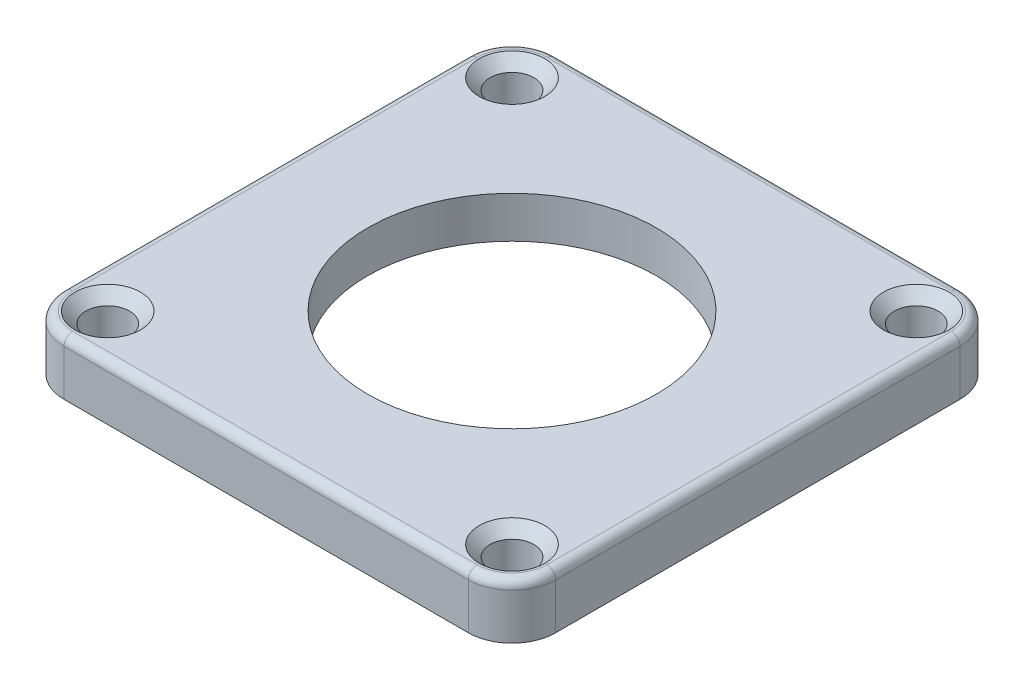
ISO-10303-21;
HEADER;
FILE_DESCRIPTION(('STEP AP214'),'2;1');
FILE_NAME('part.step','',(''),(''),'','','');
FILE_SCHEMA(('AUTOMOTIVE_DESIGN { 1 0 10303 214 1 1 1 1 }'));
ENDSEC;
DATA;
#1=APPLICATION_CONTEXT('core data for automotive mechanical design processes');
#2=APPLICATION_PROTOCOL_DEFINITION('international standard','automotive_design',2000,#1);
#3=PRODUCT_CONTEXT('',#1,'mechanical');
#4=PRODUCT('Part','Part','',(#3));
#5=PRODUCT_RELATED_PRODUCT_CATEGORY('part','',(#4));
#6=PRODUCT_DEFINITION_FORMATION('','',#4);
#7=PRODUCT_DEFINITION_CONTEXT('part definition',#1,'design');
#8=PRODUCT_DEFINITION('design','',#6,#7);
#9=PRODUCT_DEFINITION_SHAPE('','',#8);
#10=(LENGTH_UNIT() NAMED_UNIT(*) SI_UNIT(.MILLI.,.METRE.));
#11=(NAMED_UNIT(*) PLANE_ANGLE_UNIT() SI_UNIT($,.RADIAN.));
#12=(NAMED_UNIT(*) SI_UNIT($,.STERADIAN.) SOLID_ANGLE_UNIT());
#13=UNCERTAINTY_MEASURE_WITH_UNIT(LENGTH_MEASURE(1.E-05),#10,'distance_accuracy_value','');
#14=(GEOMETRIC_REPRESENTATION_CONTEXT(3) GLOBAL_UNCERTAINTY_ASSIGNED_CONTEXT((#13)) GLOBAL_UNIT_ASSIGNED_CONTEXT((#10,
#11,#12)) REPRESENTATION_CONTEXT('',''));
#15=CARTESIAN_POINT('',(0.,0.,0.));
#16=DIRECTION('',(0.,0.,1.));
#17=DIRECTION('',(1.,0.,0.));
#18=AXIS2_PLACEMENT_3D('',#15,#16,#17);
#19=CARTESIAN_POINT('',(0.,0.,0.));
#20=DIRECTION('',(0.,-1.,0.));
#21=DIRECTION('',(0.,0.,-1.));
#22=AXIS2_PLACEMENT_3D('',#19,#20,#21);
#23=PLANE('',#22);
#24=CARTESIAN_POINT('',(-23.495,0.,-23.495));
#25=DIRECTION('',(0.,1.,0.));
#26=DIRECTION('',(0.,0.,1.));
#27=AXIS2_PLACEMENT_3D('',#24,#25,#26);
#28=CIRCLE('',#27,2.54);
#29=CARTESIAN_POINT('',(-23.495,0.,-20.955));
#30=VERTEX_POINT('',#29);
#31=EDGE_CURVE('E229',#30,#30,#28,.T.);
#32=ORIENTED_EDGE('',*,*,#31,.T.);
#33=EDGE_LOOP('',(#32));
#34=FACE_BOUND('',#33,.T.);
#35=CARTESIAN_POINT('',(23.495,0.,-23.495));
#36=DIRECTION('',(0.,1.,0.));
#37=DIRECTION('',(0.,0.,1.));
#38=AXIS2_PLACEMENT_3D('',#35,#36,#37);
#39=CIRCLE('',#38,2.54);
#40=CARTESIAN_POINT('',(23.495,0.,-20.955));
#41=VERTEX_POINT('',#40);
#42=EDGE_CURVE('E242',#41,#41,#39,.T.);
#43=ORIENTED_EDGE('',*,*,#42,.T.);
#44=EDGE_LOOP('',(#43));
#45=FACE_BOUND('',#44,.T.);
#46=DIRECTION('',(1.,0.,0.));
#47=VECTOR('',#46,1.);
#48=CARTESIAN_POINT('',(-28.575,0.,28.575));
#49=LINE('',#48,#47);
#50=CARTESIAN_POINT('',(-23.495,0.,28.575));
#51=VERTEX_POINT('',#50);
#52=CARTESIAN_POINT('',(23.495,0.,28.575));
#53=VERTEX_POINT('',#52);
#54=EDGE_CURVE('E125',#51,#53,#49,.T.);
#55=ORIENTED_EDGE('',*,*,#54,.F.);
#56=CARTESIAN_POINT('',(-23.495,0.,23.495));
#57=DIRECTION('',(0.,-1.,0.));
#58=DIRECTION('',(0.,0.,-1.));
#59=AXIS2_PLACEMENT_3D('',#56,#57,#58);
#60=CIRCLE('',#59,5.08);
#61=CARTESIAN_POINT('',(-28.575,0.,23.495));
#62=VERTEX_POINT('',#61);
#63=EDGE_CURVE('E131',#51,#62,#60,.T.);
#64=ORIENTED_EDGE('',*,*,#63,.T.);
#65=DIRECTION('',(0.,0.,1.));
#66=VECTOR('',#65,1.);
#67=CARTESIAN_POINT('',(-28.575,0.,28.575));
#68=LINE('',#67,#66);
#69=CARTESIAN_POINT('',(-28.575,0.,-23.495));
#70=VERTEX_POINT('',#69);
#71=EDGE_CURVE('E143',#70,#62,#68,.T.);
#72=ORIENTED_EDGE('',*,*,#71,.F.);
#73=CARTESIAN_POINT('',(-23.495,0.,-23.495));
#74=DIRECTION('',(0.,-1.,0.));
#75=DIRECTION('',(0.,0.,-1.));
#76=AXIS2_PLACEMENT_3D('',#73,#74,#75);
#77=CIRCLE('',#76,5.08);
#78=CARTESIAN_POINT('',(-23.495,0.,-28.575));
#79=VERTEX_POINT('',#78);
#80=EDGE_CURVE('E128',#70,#79,#77,.T.);
#81=ORIENTED_EDGE('',*,*,#80,.T.);
#82=DIRECTION('',(-1.,0.,0.));
#83=VECTOR('',#82,1.);
#84=CARTESIAN_POINT('',(-28.575,0.,-28.575));
#85=LINE('',#84,#83);
#86=CARTESIAN_POINT('',(23.495,0.,-28.575));
#87=VERTEX_POINT('',#86);
#88=EDGE_CURVE('E146',#87,#79,#85,.T.);
#89=ORIENTED_EDGE('',*,*,#88,.F.);
#90=CARTESIAN_POINT('',(23.495,0.,-23.495));
#91=DIRECTION('',(0.,-1.,0.));
#92=DIRECTION('',(0.,0.,-1.));
#93=AXIS2_PLACEMENT_3D('',#90,#91,#92);
#94=CIRCLE('',#93,5.08);
#95=CARTESIAN_POINT('',(28.575,0.,-23.495));
#96=VERTEX_POINT('',#95);
#97=EDGE_CURVE('E151',#87,#96,#94,.T.);
#98=ORIENTED_EDGE('',*,*,#97,.T.);
#99=DIRECTION('',(0.,0.,-1.));
#100=VECTOR('',#99,1.);
#101=CARTESIAN_POINT('',(28.575,0.,28.575));
#102=LINE('',#101,#100);
#103=CARTESIAN_POINT('',(28.575,0.,23.495));
#104=VERTEX_POINT('',#103);
#105=EDGE_CURVE('E267',#104,#96,#102,.T.);
#106=ORIENTED_EDGE('',*,*,#105,.F.);
#107=CARTESIAN_POINT('',(23.495,0.,23.495));
#108=DIRECTION('',(0.,-1.,0.));
#109=DIRECTION('',(0.,0.,-1.));
#110=AXIS2_PLACEMENT_3D('',#107,#108,#109);
#111=CIRCLE('',#110,5.08);
#112=EDGE_CURVE('E138',#104,#53,#111,.T.);
#113=ORIENTED_EDGE('',*,*,#112,.T.);
#114=EDGE_LOOP('',(#55,#64,#72,#81,#89,#98,#106,#113));
#115=FACE_BOUND('',#114,.T.);
#116=CARTESIAN_POINT('',(0.,0.,0.));
#117=DIRECTION('',(0.,-1.,0.));
#118=DIRECTION('',(0.,0.,-1.));
#119=AXIS2_PLACEMENT_3D('',#116,#117,#118);
#120=CIRCLE('',#119,19.05);
#121=CARTESIAN_POINT('',(0.,0.,-19.05));
#122=VERTEX_POINT('',#121);
#123=EDGE_CURVE('E263',#122,#122,#120,.T.);
#124=ORIENTED_EDGE('',*,*,#123,.F.);
#125=EDGE_LOOP('',(#124));
#126=FACE_BOUND('',#125,.T.);
#127=CARTESIAN_POINT('',(23.495,0.,23.495));
#128=DIRECTION('',(0.,1.,0.));
#129=DIRECTION('',(0.,0.,1.));
#130=AXIS2_PLACEMENT_3D('',#127,#128,#129);
#131=CIRCLE('',#130,2.54);
#132=CARTESIAN_POINT('',(23.495,0.,26.035));
#133=VERTEX_POINT('',#132);
#134=EDGE_CURVE('E260',#133,#133,#131,.T.);
#135=ORIENTED_EDGE('',*,*,#134,.T.);
#136=EDGE_LOOP('',(#135));
#137=FACE_BOUND('',#136,.T.);
#138=CARTESIAN_POINT('',(-23.495,0.,23.495));
#139=DIRECTION('',(0.,1.,0.));
#140=DIRECTION('',(0.,0.,1.));
#141=AXIS2_PLACEMENT_3D('',#138,#139,#140);
#142=CIRCLE('',#141,2.54);
#143=CARTESIAN_POINT('',(-23.495,0.,26.035));
#144=VERTEX_POINT('',#143);
#145=EDGE_CURVE('E251',#144,#144,#142,.T.);
#146=ORIENTED_EDGE('',*,*,#145,.T.);
#147=EDGE_LOOP('',(#146));
#148=FACE_BOUND('',#147,.T.);
#149=ADVANCED_FACE('F32',(#34,#45,#115,#126,#137,#148),#23,.T.);
#150=CARTESIAN_POINT('',(28.575,6.35,28.575));
#151=DIRECTION('',(-1.,0.,0.));
#152=DIRECTION('',(0.,0.,1.));
#153=AXIS2_PLACEMENT_3D('',#150,#151,#152);
#154=PLANE('',#153);
#155=DIRECTION('',(0.,-1.,0.));
#156=VECTOR('',#155,1.);
#157=CARTESIAN_POINT('',(28.575,6.35,-23.495));
#158=LINE('',#157,#156);
#159=CARTESIAN_POINT('',(28.575,5.334,-23.495));
#160=VERTEX_POINT('',#159);
#161=EDGE_CURVE('E156',#96,#160,#158,.F.);
#162=ORIENTED_EDGE('',*,*,#161,.T.);
#163=DIRECTION('',(0.,0.,-1.));
#164=VECTOR('',#163,1.);
#165=CARTESIAN_POINT('',(28.575,5.334,28.575));
#166=LINE('',#165,#164);
#167=CARTESIAN_POINT('',(28.575,5.334,23.495));
#168=VERTEX_POINT('',#167);
#169=EDGE_CURVE('E190',#160,#168,#166,.F.);
#170=ORIENTED_EDGE('',*,*,#169,.T.);
#171=DIRECTION('',(0.,-1.,0.));
#172=VECTOR('',#171,1.);
#173=CARTESIAN_POINT('',(28.575,6.35,23.495));
#174=LINE('',#173,#172);
#175=EDGE_CURVE('E159',#168,#104,#174,.T.);
#176=ORIENTED_EDGE('',*,*,#175,.T.);
#177=ORIENTED_EDGE('',*,*,#105,.T.);
#178=EDGE_LOOP('',(#162,#170,#176,#177));
#179=FACE_BOUND('',#178,.T.);
#180=ADVANCED_FACE('F313',(#179),#154,.F.);
#181=CARTESIAN_POINT('',(-28.575,6.35,-28.575));
#182=DIRECTION('',(0.,0.,1.));
#183=DIRECTION('',(1.,0.,0.));
#184=AXIS2_PLACEMENT_3D('',#181,#182,#183);
#185=PLANE('',#184);
#186=DIRECTION('',(0.,-1.,0.));
#187=VECTOR('',#186,1.);
#188=CARTESIAN_POINT('',(-23.495,6.35,-28.575));
#189=LINE('',#188,#187);
#190=CARTESIAN_POINT('',(-23.495,5.334,-28.575));
#191=VERTEX_POINT('',#190);
#192=EDGE_CURVE('E161',#79,#191,#189,.F.);
#193=ORIENTED_EDGE('',*,*,#192,.T.);
#194=DIRECTION('',(-1.,0.,0.));
#195=VECTOR('',#194,1.);
#196=CARTESIAN_POINT('',(-28.575,5.334,-28.575));
#197=LINE('',#196,#195);
#198=CARTESIAN_POINT('',(23.495,5.334,-28.575));
#199=VERTEX_POINT('',#198);
#200=EDGE_CURVE('E186',#191,#199,#197,.F.);
#201=ORIENTED_EDGE('',*,*,#200,.T.);
#202=DIRECTION('',(0.,-1.,0.));
#203=VECTOR('',#202,1.);
#204=CARTESIAN_POINT('',(23.495,6.35,-28.575));
#205=LINE('',#204,#203);
#206=EDGE_CURVE('E164',#199,#87,#205,.T.);
#207=ORIENTED_EDGE('',*,*,#206,.T.);
#208=ORIENTED_EDGE('',*,*,#88,.T.);
#209=EDGE_LOOP('',(#193,#201,#207,#208));
#210=FACE_BOUND('',#209,.T.);
#211=ADVANCED_FACE('F275',(#210),#185,.F.);
#212=CARTESIAN_POINT('',(-28.575,6.35,28.575));
#213=DIRECTION('',(1.,0.,0.));
#214=DIRECTION('',(0.,0.,-1.));
#215=AXIS2_PLACEMENT_3D('',#212,#213,#214);
#216=PLANE('',#215);
#217=DIRECTION('',(0.,-1.,0.));
#218=VECTOR('',#217,1.);
#219=CARTESIAN_POINT('',(-28.575,6.35,23.495));
#220=LINE('',#219,#218);
#221=CARTESIAN_POINT('',(-28.575,5.334,23.495));
#222=VERTEX_POINT('',#221);
#223=EDGE_CURVE('E133',#62,#222,#220,.F.);
#224=ORIENTED_EDGE('',*,*,#223,.T.);
#225=DIRECTION('',(0.,0.,1.));
#226=VECTOR('',#225,1.);
#227=CARTESIAN_POINT('',(-28.575,5.334,28.575));
#228=LINE('',#227,#226);
#229=CARTESIAN_POINT('',(-28.575,5.334,-23.495));
#230=VERTEX_POINT('',#229);
#231=EDGE_CURVE('E11',#222,#230,#228,.F.);
#232=ORIENTED_EDGE('',*,*,#231,.T.);
#233=DIRECTION('',(0.,-1.,0.));
#234=VECTOR('',#233,1.);
#235=CARTESIAN_POINT('',(-28.575,6.35,-23.495));
#236=LINE('',#235,#234);
#237=EDGE_CURVE('E137',#230,#70,#236,.T.);
#238=ORIENTED_EDGE('',*,*,#237,.T.);
#239=ORIENTED_EDGE('',*,*,#71,.T.);
#240=EDGE_LOOP('',(#224,#232,#238,#239));
#241=FACE_BOUND('',#240,.T.);
#242=ADVANCED_FACE('F343',(#241),#216,.F.);
#243=CARTESIAN_POINT('',(-28.575,6.35,28.575));
#244=DIRECTION('',(0.,0.,-1.));
#245=DIRECTION('',(-1.,0.,0.));
#246=AXIS2_PLACEMENT_3D('',#243,#244,#245);
#247=PLANE('',#246);
#248=DIRECTION('',(0.,-1.,0.));
#249=VECTOR('',#248,1.);
#250=CARTESIAN_POINT('',(23.495,6.35,28.575));
#251=LINE('',#250,#249);
#252=CARTESIAN_POINT('',(23.495,5.334,28.575));
#253=VERTEX_POINT('',#252);
#254=EDGE_CURVE('E129',#53,#253,#251,.F.);
#255=ORIENTED_EDGE('',*,*,#254,.T.);
#256=DIRECTION('',(1.,0.,0.));
#257=VECTOR('',#256,1.);
#258=CARTESIAN_POINT('',(-28.575,5.334,28.575));
#259=LINE('',#258,#257);
#260=CARTESIAN_POINT('',(-23.495,5.334,28.575));
#261=VERTEX_POINT('',#260);
#262=EDGE_CURVE('E56',#253,#261,#259,.F.);
#263=ORIENTED_EDGE('',*,*,#262,.T.);
#264=DIRECTION('',(0.,-1.,0.));
#265=VECTOR('',#264,1.);
#266=CARTESIAN_POINT('',(-23.495,6.35,28.575));
#267=LINE('',#266,#265);
#268=EDGE_CURVE('E121',#261,#51,#267,.T.);
#269=ORIENTED_EDGE('',*,*,#268,.T.);
#270=ORIENTED_EDGE('',*,*,#54,.T.);
#271=EDGE_LOOP('',(#255,#263,#269,#270));
#272=FACE_BOUND('',#271,.T.);
#273=ADVANCED_FACE('F123',(#272),#247,.F.);
#274=CARTESIAN_POINT('',(0.,6.35,0.));
#275=DIRECTION('',(0.,-1.,0.));
#276=DIRECTION('',(0.,0.,-1.));
#277=AXIS2_PLACEMENT_3D('',#274,#275,#276);
#278=PLANE('',#277);
#279=CARTESIAN_POINT('',(0.,6.35,0.));
#280=DIRECTION('',(0.,1.,0.));
#281=DIRECTION('',(0.,0.,1.));
#282=AXIS2_PLACEMENT_3D('',#279,#280,#281);
#283=CIRCLE('',#282,16.764);
#284=CARTESIAN_POINT('',(0.,6.35,16.764));
#285=VERTEX_POINT('',#284);
#286=EDGE_CURVE('E608',#285,#285,#283,.T.);
#287=ORIENTED_EDGE('',*,*,#286,.F.);
#288=EDGE_LOOP('',(#287));
#289=FACE_BOUND('',#288,.T.);
#290=DIRECTION('',(-1.,0.,0.));
#291=VECTOR('',#290,1.);
#292=CARTESIAN_POINT('',(0.,6.35,-27.559));
#293=LINE('',#292,#291);
#294=CARTESIAN_POINT('',(23.495,6.35,-27.559));
#295=VERTEX_POINT('',#294);
#296=CARTESIAN_POINT('',(-23.495,6.35,-27.559));
#297=VERTEX_POINT('',#296);
#298=EDGE_CURVE('E178',#295,#297,#293,.T.);
#299=ORIENTED_EDGE('',*,*,#298,.T.);
#300=CARTESIAN_POINT('',(-23.495,6.35,-23.495));
#301=DIRECTION('',(0.,-1.,0.));
#302=DIRECTION('',(0.,0.,-1.));
#303=AXIS2_PLACEMENT_3D('',#300,#301,#302);
#304=CIRCLE('',#303,4.064);
#305=CARTESIAN_POINT('',(-27.559,6.35,-23.495));
#306=VERTEX_POINT('',#305);
#307=EDGE_CURVE('E180',#297,#306,#304,.F.);
#308=ORIENTED_EDGE('',*,*,#307,.T.);
#309=DIRECTION('',(0.,0.,1.));
#310=VECTOR('',#309,1.);
#311=CARTESIAN_POINT('',(-27.559,6.35,0.));
#312=LINE('',#311,#310);
#313=CARTESIAN_POINT('',(-27.559,6.35,23.495));
#314=VERTEX_POINT('',#313);
#315=EDGE_CURVE('E166',#306,#314,#312,.T.);
#316=ORIENTED_EDGE('',*,*,#315,.T.);
#317=CARTESIAN_POINT('',(-23.495,6.35,23.495));
#318=DIRECTION('',(0.,-1.,0.));
#319=DIRECTION('',(0.,0.,-1.));
#320=AXIS2_PLACEMENT_3D('',#317,#318,#319);
#321=CIRCLE('',#320,4.064);
#322=CARTESIAN_POINT('',(-23.495,6.35,27.559));
#323=VERTEX_POINT('',#322);
#324=EDGE_CURVE('E168',#314,#323,#321,.F.);
#325=ORIENTED_EDGE('',*,*,#324,.T.);
#326=DIRECTION('',(1.,0.,0.));
#327=VECTOR('',#326,1.);
#328=CARTESIAN_POINT('',(0.,6.35,27.559));
#329=LINE('',#328,#327);
#330=CARTESIAN_POINT('',(23.495,6.35,27.559));
#331=VERTEX_POINT('',#330);
#332=EDGE_CURVE('E170',#323,#331,#329,.T.);
#333=ORIENTED_EDGE('',*,*,#332,.T.);
#334=CARTESIAN_POINT('',(23.495,6.35,23.495));
#335=DIRECTION('',(0.,-1.,0.));
#336=DIRECTION('',(0.,0.,-1.));
#337=AXIS2_PLACEMENT_3D('',#334,#335,#336);
#338=CIRCLE('',#337,4.064);
#339=CARTESIAN_POINT('',(27.559,6.35,23.495));
#340=VERTEX_POINT('',#339);
#341=EDGE_CURVE('E172',#331,#340,#338,.F.);
#342=ORIENTED_EDGE('',*,*,#341,.T.);
#343=DIRECTION('',(0.,0.,-1.));
#344=VECTOR('',#343,1.);
#345=CARTESIAN_POINT('',(27.559,6.35,0.));
#346=LINE('',#345,#344);
#347=CARTESIAN_POINT('',(27.559,6.35,-23.495));
#348=VERTEX_POINT('',#347);
#349=EDGE_CURVE('E174',#340,#348,#346,.T.);
#350=ORIENTED_EDGE('',*,*,#349,.T.);
#351=CARTESIAN_POINT('',(23.495,6.35,-23.495));
#352=DIRECTION('',(0.,-1.,0.));
#353=DIRECTION('',(0.,0.,-1.));
#354=AXIS2_PLACEMENT_3D('',#351,#352,#353);
#355=CIRCLE('',#354,4.064);
#356=EDGE_CURVE('E176',#348,#295,#355,.F.);
#357=ORIENTED_EDGE('',*,*,#356,.T.);
#358=EDGE_LOOP('',(#299,#308,#316,#325,#333,#342,#350,#357));
#359=FACE_BOUND('',#358,.T.);
#360=CARTESIAN_POINT('',(-23.495,6.35,-23.495));
#361=DIRECTION('',(0.,1.,0.));
#362=DIRECTION('',(0.,0.,1.));
#363=AXIS2_PLACEMENT_3D('',#360,#361,#362);
#364=CIRCLE('',#363,3.81);
#365=CARTESIAN_POINT('',(-23.495,6.35,-19.685));
#366=VERTEX_POINT('',#365);
#367=EDGE_CURVE('E218',#366,#366,#364,.T.);
#368=ORIENTED_EDGE('',*,*,#367,.F.);
#369=EDGE_LOOP('',(#368));
#370=FACE_BOUND('',#369,.T.);
#371=CARTESIAN_POINT('',(23.495,6.35,-23.495));
#372=DIRECTION('',(0.,1.,0.));
#373=DIRECTION('',(0.,0.,1.));
#374=AXIS2_PLACEMENT_3D('',#371,#372,#373);
#375=CIRCLE('',#374,3.81);
#376=CARTESIAN_POINT('',(23.495,6.35,-19.685));
#377=VERTEX_POINT('',#376);
#378=EDGE_CURVE('E236',#377,#377,#375,.T.);
#379=ORIENTED_EDGE('',*,*,#378,.F.);
#380=EDGE_LOOP('',(#379));
#381=FACE_BOUND('',#380,.T.);
#382=CARTESIAN_POINT('',(-23.495,6.35,23.495));
#383=DIRECTION('',(0.,1.,0.));
#384=DIRECTION('',(0.,0.,1.));
#385=AXIS2_PLACEMENT_3D('',#382,#383,#384);
#386=CIRCLE('',#385,3.81);
#387=CARTESIAN_POINT('',(-23.495,6.35,27.305));
#388=VERTEX_POINT('',#387);
#389=EDGE_CURVE('E245',#388,#388,#386,.T.);
#390=ORIENTED_EDGE('',*,*,#389,.F.);
#391=EDGE_LOOP('',(#390));
#392=FACE_BOUND('',#391,.T.);
#393=CARTESIAN_POINT('',(23.495,6.35,23.495));
#394=DIRECTION('',(0.,1.,0.));
#395=DIRECTION('',(0.,0.,1.));
#396=AXIS2_PLACEMENT_3D('',#393,#394,#395);
#397=CIRCLE('',#396,3.81);
#398=CARTESIAN_POINT('',(23.495,6.35,27.305));
#399=VERTEX_POINT('',#398);
#400=EDGE_CURVE('E254',#399,#399,#397,.T.);
#401=ORIENTED_EDGE('',*,*,#400,.F.);
#402=EDGE_LOOP('',(#401));
#403=FACE_BOUND('',#402,.T.);
#404=ADVANCED_FACE('F296',(#289,#359,#370,#381,#392,#403),#278,.F.);
#405=CARTESIAN_POINT('',(-23.495,6.35,23.495));
#406=DIRECTION('',(0.,-1.,0.));
#407=DIRECTION('',(0.,0.,-1.));
#408=AXIS2_PLACEMENT_3D('',#405,#406,#407);
#409=CYLINDRICAL_SURFACE('',#408,5.08);
#410=ORIENTED_EDGE('',*,*,#268,.F.);
#411=CARTESIAN_POINT('',(-23.495,5.334,23.495));
#412=DIRECTION('',(0.,-1.,0.));
#413=DIRECTION('',(0.,0.,-1.));
#414=AXIS2_PLACEMENT_3D('',#411,#412,#413);
#415=CIRCLE('',#414,5.08);
#416=EDGE_CURVE('E41',#261,#222,#415,.T.);
#417=ORIENTED_EDGE('',*,*,#416,.T.);
#418=ORIENTED_EDGE('',*,*,#223,.F.);
#419=ORIENTED_EDGE('',*,*,#63,.F.);
#420=EDGE_LOOP('',(#410,#417,#418,#419));
#421=FACE_BOUND('',#420,.T.);
#422=ADVANCED_FACE('F132',(#421),#409,.T.);
#423=CARTESIAN_POINT('',(23.495,6.35,23.495));
#424=DIRECTION('',(0.,-1.,0.));
#425=DIRECTION('',(0.,0.,-1.));
#426=AXIS2_PLACEMENT_3D('',#423,#424,#425);
#427=CYLINDRICAL_SURFACE('',#426,5.08);
#428=ORIENTED_EDGE('',*,*,#175,.F.);
#429=CARTESIAN_POINT('',(23.495,5.334,23.495));
#430=DIRECTION('',(0.,-1.,0.));
#431=DIRECTION('',(0.,0.,-1.));
#432=AXIS2_PLACEMENT_3D('',#429,#430,#431);
#433=CIRCLE('',#432,5.08);
#434=EDGE_CURVE('E192',#168,#253,#433,.T.);
#435=ORIENTED_EDGE('',*,*,#434,.T.);
#436=ORIENTED_EDGE('',*,*,#254,.F.);
#437=ORIENTED_EDGE('',*,*,#112,.F.);
#438=EDGE_LOOP('',(#428,#435,#436,#437));
#439=FACE_BOUND('',#438,.T.);
#440=ADVANCED_FACE('F316',(#439),#427,.T.);
#441=CARTESIAN_POINT('',(23.495,6.35,-23.495));
#442=DIRECTION('',(0.,-1.,0.));
#443=DIRECTION('',(0.,0.,-1.));
#444=AXIS2_PLACEMENT_3D('',#441,#442,#443);
#445=CYLINDRICAL_SURFACE('',#444,5.08);
#446=ORIENTED_EDGE('',*,*,#206,.F.);
#447=CARTESIAN_POINT('',(23.495,5.334,-23.495));
#448=DIRECTION('',(0.,-1.,0.));
#449=DIRECTION('',(0.,0.,-1.));
#450=AXIS2_PLACEMENT_3D('',#447,#448,#449);
#451=CIRCLE('',#450,5.08);
#452=EDGE_CURVE('E188',#199,#160,#451,.T.);
#453=ORIENTED_EDGE('',*,*,#452,.T.);
#454=ORIENTED_EDGE('',*,*,#161,.F.);
#455=ORIENTED_EDGE('',*,*,#97,.F.);
#456=EDGE_LOOP('',(#446,#453,#454,#455));
#457=FACE_BOUND('',#456,.T.);
#458=ADVANCED_FACE('F305',(#457),#445,.T.);
#459=CARTESIAN_POINT('',(-23.495,6.35,-23.495));
#460=DIRECTION('',(0.,-1.,0.));
#461=DIRECTION('',(0.,0.,-1.));
#462=AXIS2_PLACEMENT_3D('',#459,#460,#461);
#463=CYLINDRICAL_SURFACE('',#462,5.08);
#464=ORIENTED_EDGE('',*,*,#237,.F.);
#465=CARTESIAN_POINT('',(-23.495,5.334,-23.495));
#466=DIRECTION('',(0.,-1.,0.));
#467=DIRECTION('',(0.,0.,-1.));
#468=AXIS2_PLACEMENT_3D('',#465,#466,#467);
#469=CIRCLE('',#468,5.08);
#470=EDGE_CURVE('E183',#230,#191,#469,.T.);
#471=ORIENTED_EDGE('',*,*,#470,.T.);
#472=ORIENTED_EDGE('',*,*,#192,.F.);
#473=ORIENTED_EDGE('',*,*,#80,.F.);
#474=EDGE_LOOP('',(#464,#471,#472,#473));
#475=FACE_BOUND('',#474,.T.);
#476=ADVANCED_FACE('F281',(#475),#463,.T.);
#477=CARTESIAN_POINT('',(0.,1.524,0.));
#478=DIRECTION('',(0.,-1.,0.));
#479=DIRECTION('',(0.,0.,-1.));
#480=AXIS2_PLACEMENT_3D('',#477,#478,#479);
#481=CYLINDRICAL_SURFACE('',#480,19.05);
#482=CARTESIAN_POINT('',(0.,1.524,0.));
#483=DIRECTION('',(0.,-1.,0.));
#484=DIRECTION('',(0.,0.,-1.));
#485=AXIS2_PLACEMENT_3D('',#482,#483,#484);
#486=CIRCLE('',#485,19.05);
#487=CARTESIAN_POINT('',(0.,1.524,-19.05));
#488=VERTEX_POINT('',#487);
#489=EDGE_CURVE('E264',#488,#488,#486,.T.);
#490=CARTESIAN_POINT('',(0.,1.524,-19.05));
#491=CARTESIAN_POINT('',(0.,1.508125,-19.05));
#492=CARTESIAN_POINT('',(0.,1.49225,-19.05));
#493=CARTESIAN_POINT('',(0.,1.4605,-19.05));
#494=CARTESIAN_POINT('',(0.,1.444625,-19.05));
#495=CARTESIAN_POINT('',(0.,1.412875,-19.05));
#496=CARTESIAN_POINT('',(0.,1.397,-19.05));
#497=CARTESIAN_POINT('',(0.,1.36525,-19.05));
#498=CARTESIAN_POINT('',(0.,1.349375,-19.05));
#499=CARTESIAN_POINT('',(0.,1.317625,-19.05));
#500=CARTESIAN_POINT('',(0.,1.30175,-19.05));
#501=CARTESIAN_POINT('',(0.,1.27,-19.05));
#502=CARTESIAN_POINT('',(0.,1.254125,-19.05));
#503=CARTESIAN_POINT('',(0.,1.222375,-19.05));
#504=CARTESIAN_POINT('',(0.,1.2065,-19.05));
#505=CARTESIAN_POINT('',(0.,1.17475,-19.05));
#506=CARTESIAN_POINT('',(0.,1.158875,-19.05));
#507=CARTESIAN_POINT('',(0.,1.127125,-19.05));
#508=CARTESIAN_POINT('',(0.,1.11125,-19.05));
#509=CARTESIAN_POINT('',(0.,1.0795,-19.05));
#510=CARTESIAN_POINT('',(0.,1.063625,-19.05));
#511=CARTESIAN_POINT('',(0.,1.031875,-19.05));
#512=CARTESIAN_POINT('',(0.,1.016,-19.05));
#513=CARTESIAN_POINT('',(0.,0.98425,-19.05));
#514=CARTESIAN_POINT('',(0.,0.968375,-19.05));
#515=CARTESIAN_POINT('',(0.,0.936625,-19.05));
#516=CARTESIAN_POINT('',(0.,0.92075,-19.05));
#517=CARTESIAN_POINT('',(0.,0.889,-19.05));
#518=CARTESIAN_POINT('',(0.,0.873125,-19.05));
#519=CARTESIAN_POINT('',(0.,0.841375,-19.05));
#520=CARTESIAN_POINT('',(0.,0.8255,-19.05));
#521=CARTESIAN_POINT('',(0.,0.79375,-19.05));
#522=CARTESIAN_POINT('',(0.,0.777875,-19.05));
#523=CARTESIAN_POINT('',(0.,0.746125,-19.05));
#524=CARTESIAN_POINT('',(0.,0.73025,-19.05));
#525=CARTESIAN_POINT('',(0.,0.6985,-19.05));
#526=CARTESIAN_POINT('',(0.,0.682625,-19.05));
#527=CARTESIAN_POINT('',(0.,0.650875,-19.05));
#528=CARTESIAN_POINT('',(0.,0.635,-19.05));
#529=CARTESIAN_POINT('',(0.,0.60325,-19.05));
#530=CARTESIAN_POINT('',(0.,0.587375,-19.05));
#531=CARTESIAN_POINT('',(0.,0.555625,-19.05));
#532=CARTESIAN_POINT('',(0.,0.53975,-19.05));
#533=CARTESIAN_POINT('',(0.,0.508,-19.05));
#534=CARTESIAN_POINT('',(0.,0.492125,-19.05));
#535=CARTESIAN_POINT('',(0.,0.460375,-19.05));
#536=CARTESIAN_POINT('',(0.,0.4445,-19.05));
#537=CARTESIAN_POINT('',(0.,0.41275,-19.05));
#538=CARTESIAN_POINT('',(0.,0.396875,-19.05));
#539=CARTESIAN_POINT('',(0.,0.365125,-19.05));
#540=CARTESIAN_POINT('',(0.,0.34925,-19.05));
#541=CARTESIAN_POINT('',(0.,0.3175,-19.05));
#542=CARTESIAN_POINT('',(0.,0.301625,-19.05));
#543=CARTESIAN_POINT('',(0.,0.269875,-19.05));
#544=CARTESIAN_POINT('',(0.,0.254,-19.05));
#545=CARTESIAN_POINT('',(0.,0.22225,-19.05));
#546=CARTESIAN_POINT('',(0.,0.206375,-19.05));
#547=CARTESIAN_POINT('',(0.,0.174625,-19.05));
#548=CARTESIAN_POINT('',(0.,0.15875,-19.05));
#549=CARTESIAN_POINT('',(0.,0.127,-19.05));
#550=CARTESIAN_POINT('',(0.,0.111125,-19.05));
#551=CARTESIAN_POINT('',(0.,0.079375,-19.05));
#552=CARTESIAN_POINT('',(0.,0.0635,-19.05));
#553=CARTESIAN_POINT('',(0.,0.0317499999999999,-19.05));
#554=CARTESIAN_POINT('',(0.,0.015875,-19.05));
#555=CARTESIAN_POINT('',(0.,0.,-19.05));
#556=B_SPLINE_CURVE_WITH_KNOTS('',3,(#490,#491,#492,#493,#494,#495,#496,#497,#498,#499,#500,
#501,#502,#503,#504,#505,#506,#507,#508,#509,#510,#511,#512,#513,#514,#515,#516,#517,#518,#519,
#520,#521,#522,#523,#524,#525,#526,#527,#528,#529,#530,#531,#532,#533,#534,#535,#536,#537,#538,
#539,#540,#541,#542,#543,#544,#545,#546,#547,#548,#549,#550,#551,#552,#553,#554,#555),
.UNSPECIFIED.,.F.,.F.,(4,2,2,2,2,2,2,2,2,2,2,2,2,2,2,2,2,2,2,2,2,2,2,2,2,2,2,2,2,2,2,2,4),(0.,
0.0476250000000001,0.0952500000000001,0.142875,0.1905,0.238125,0.28575,0.333375,0.381,0.428625,
0.47625,0.523875,0.5715,0.619125,0.66675,0.714375,0.762,0.809625,0.85725,0.904875,0.9525,
1.000125,1.04775,1.095375,1.143,1.190625,1.23825,1.285875,1.3335,1.381125,1.42875,1.476375,
1.524),.UNSPECIFIED.);
#557=EDGE_CURVE('BSEAM357',#488,#122,#556,.T.);
#558=ORIENTED_EDGE('',*,*,#489,.F.);
#559=ORIENTED_EDGE('',*,*,#123,.T.);
#560=ORIENTED_EDGE('',*,*,#557,.T.);
#561=ORIENTED_EDGE('',*,*,#557,.F.);
#562=EDGE_LOOP('',(#558,#560,#559,#561));
#563=FACE_BOUND('',#562,.T.);
#564=ADVANCED_FACE('F357',(#563),#481,.F.);
#565=CARTESIAN_POINT('',(0.,1.524,0.));
#566=DIRECTION('',(0.,-1.,0.));
#567=DIRECTION('',(0.,0.,-1.));
#568=AXIS2_PLACEMENT_3D('',#565,#566,#567);
#569=PLANE('',#568);
#570=CARTESIAN_POINT('',(0.,1.524,0.));
#571=DIRECTION('',(0.,-1.,0.));
#572=DIRECTION('',(0.,0.,-1.));
#573=AXIS2_PLACEMENT_3D('',#570,#571,#572);
#574=CIRCLE('',#573,16.764);
#575=CARTESIAN_POINT('',(0.,1.524,-16.764));
#576=VERTEX_POINT('',#575);
#577=EDGE_CURVE('E199',#576,#576,#574,.F.);
#578=ORIENTED_EDGE('',*,*,#577,.T.);
#579=EDGE_LOOP('',(#578));
#580=FACE_BOUND('',#579,.T.);
#581=ORIENTED_EDGE('',*,*,#489,.T.);
#582=EDGE_LOOP('',(#581));
#583=FACE_BOUND('',#582,.T.);
#584=ADVANCED_FACE('F383',(#580,#583),#569,.T.);
#585=CARTESIAN_POINT('',(23.495,6.35,23.495));
#586=DIRECTION('',(0.,1.,0.));
#587=DIRECTION('',(0.,0.,1.));
#588=AXIS2_PLACEMENT_3D('',#585,#586,#587);
#589=CYLINDRICAL_SURFACE('',#588,2.54);
#590=ORIENTED_EDGE('',*,*,#134,.F.);
#591=EDGE_LOOP('',(#590));
#592=FACE_BOUND('',#591,.T.);
#593=CARTESIAN_POINT('',(23.495,5.08,23.495));
#594=DIRECTION('',(0.,1.,0.));
#595=DIRECTION('',(0.,0.,1.));
#596=AXIS2_PLACEMENT_3D('',#593,#594,#595);
#597=CIRCLE('',#596,2.54);
#598=CARTESIAN_POINT('',(23.495,5.08,26.035));
#599=VERTEX_POINT('',#598);
#600=EDGE_CURVE('E257',#599,#599,#597,.T.);
#601=ORIENTED_EDGE('',*,*,#600,.T.);
#602=EDGE_LOOP('',(#601));
#603=FACE_BOUND('',#602,.T.);
#604=ADVANCED_FACE('F387',(#592,#603),#589,.F.);
#605=CARTESIAN_POINT('',(23.495,6.35,23.495));
#606=DIRECTION('',(0.,1.,0.));
#607=DIRECTION('',(0.,0.,1.));
#608=AXIS2_PLACEMENT_3D('',#605,#606,#607);
#609=CONICAL_SURFACE('',#608,3.81,0.785398163397446);
#610=ORIENTED_EDGE('',*,*,#600,.F.);
#611=EDGE_LOOP('',(#610));
#612=FACE_BOUND('',#611,.T.);
#613=ORIENTED_EDGE('',*,*,#400,.T.);
#614=EDGE_LOOP('',(#613));
#615=FACE_BOUND('',#614,.T.);
#616=ADVANCED_FACE('F437',(#612,#615),#609,.F.);
#617=CARTESIAN_POINT('',(-23.495,6.35,23.495));
#618=DIRECTION('',(0.,1.,0.));
#619=DIRECTION('',(0.,0.,1.));
#620=AXIS2_PLACEMENT_3D('',#617,#618,#619);
#621=CYLINDRICAL_SURFACE('',#620,2.54);
#622=ORIENTED_EDGE('',*,*,#145,.F.);
#623=EDGE_LOOP('',(#622));
#624=FACE_BOUND('',#623,.T.);
#625=CARTESIAN_POINT('',(-23.495,5.08,23.495));
#626=DIRECTION('',(0.,1.,0.));
#627=DIRECTION('',(0.,0.,1.));
#628=AXIS2_PLACEMENT_3D('',#625,#626,#627);
#629=CIRCLE('',#628,2.54);
#630=CARTESIAN_POINT('',(-23.495,5.08,26.035));
#631=VERTEX_POINT('',#630);
#632=EDGE_CURVE('E248',#631,#631,#629,.T.);
#633=ORIENTED_EDGE('',*,*,#632,.T.);
#634=EDGE_LOOP('',(#633));
#635=FACE_BOUND('',#634,.T.);
#636=ADVANCED_FACE('F447',(#624,#635),#621,.F.);
#637=CARTESIAN_POINT('',(-23.495,6.35,23.495));
#638=DIRECTION('',(0.,1.,0.));
#639=DIRECTION('',(0.,0.,1.));
#640=AXIS2_PLACEMENT_3D('',#637,#638,#639);
#641=CONICAL_SURFACE('',#640,3.81,0.785398163397446);
#642=ORIENTED_EDGE('',*,*,#632,.F.);
#643=EDGE_LOOP('',(#642));
#644=FACE_BOUND('',#643,.T.);
#645=ORIENTED_EDGE('',*,*,#389,.T.);
#646=EDGE_LOOP('',(#645));
#647=FACE_BOUND('',#646,.T.);
#648=ADVANCED_FACE('F457',(#644,#647),#641,.F.);
#649=CARTESIAN_POINT('',(23.495,6.35,-23.495));
#650=DIRECTION('',(0.,1.,0.));
#651=DIRECTION('',(0.,0.,1.));
#652=AXIS2_PLACEMENT_3D('',#649,#650,#651);
#653=CYLINDRICAL_SURFACE('',#652,2.54);
#654=ORIENTED_EDGE('',*,*,#42,.F.);
#655=EDGE_LOOP('',(#654));
#656=FACE_BOUND('',#655,.T.);
#657=CARTESIAN_POINT('',(23.495,5.08,-23.495));
#658=DIRECTION('',(0.,1.,0.));
#659=DIRECTION('',(0.,0.,1.));
#660=AXIS2_PLACEMENT_3D('',#657,#658,#659);
#661=CIRCLE('',#660,2.54);
#662=CARTESIAN_POINT('',(23.495,5.08,-20.955));
#663=VERTEX_POINT('',#662);
#664=EDGE_CURVE('E239',#663,#663,#661,.T.);
#665=ORIENTED_EDGE('',*,*,#664,.T.);
#666=EDGE_LOOP('',(#665));
#667=FACE_BOUND('',#666,.T.);
#668=ADVANCED_FACE('F467',(#656,#667),#653,.F.);
#669=CARTESIAN_POINT('',(23.495,6.35,-23.495));
#670=DIRECTION('',(0.,1.,0.));
#671=DIRECTION('',(0.,0.,1.));
#672=AXIS2_PLACEMENT_3D('',#669,#670,#671);
#673=CONICAL_SURFACE('',#672,3.81,0.785398163397446);
#674=ORIENTED_EDGE('',*,*,#664,.F.);
#675=EDGE_LOOP('',(#674));
#676=FACE_BOUND('',#675,.T.);
#677=ORIENTED_EDGE('',*,*,#378,.T.);
#678=EDGE_LOOP('',(#677));
#679=FACE_BOUND('',#678,.T.);
#680=ADVANCED_FACE('F477',(#676,#679),#673,.F.);
#681=CARTESIAN_POINT('',(-23.495,6.35,-23.495));
#682=DIRECTION('',(0.,1.,0.));
#683=DIRECTION('',(0.,0.,1.));
#684=AXIS2_PLACEMENT_3D('',#681,#682,#683);
#685=CYLINDRICAL_SURFACE('',#684,2.54);
#686=ORIENTED_EDGE('',*,*,#31,.F.);
#687=EDGE_LOOP('',(#686));
#688=FACE_BOUND('',#687,.T.);
#689=CARTESIAN_POINT('',(-23.495,5.08,-23.495));
#690=DIRECTION('',(0.,1.,0.));
#691=DIRECTION('',(0.,0.,1.));
#692=AXIS2_PLACEMENT_3D('',#689,#690,#691);
#693=CIRCLE('',#692,2.54);
#694=CARTESIAN_POINT('',(-23.495,5.08,-20.955));
#695=VERTEX_POINT('',#694);
#696=EDGE_CURVE('E224',#695,#695,#693,.T.);
#697=ORIENTED_EDGE('',*,*,#696,.T.);
#698=EDGE_LOOP('',(#697));
#699=FACE_BOUND('',#698,.T.);
#700=ADVANCED_FACE('F487',(#688,#699),#685,.F.);
#701=CARTESIAN_POINT('',(-23.495,6.35,-23.495));
#702=DIRECTION('',(0.,1.,0.));
#703=DIRECTION('',(0.,0.,1.));
#704=AXIS2_PLACEMENT_3D('',#701,#702,#703);
#705=CONICAL_SURFACE('',#704,3.81,0.785398163397446);
#706=ORIENTED_EDGE('',*,*,#696,.F.);
#707=EDGE_LOOP('',(#706));
#708=FACE_BOUND('',#707,.T.);
#709=ORIENTED_EDGE('',*,*,#367,.T.);
#710=EDGE_LOOP('',(#709));
#711=FACE_BOUND('',#710,.T.);
#712=ADVANCED_FACE('F497',(#708,#711),#705,.F.);
#713=CARTESIAN_POINT('',(23.495,5.334,23.495));
#714=DIRECTION('',(0.,-1.,0.));
#715=DIRECTION('',(0.,0.,-1.));
#716=AXIS2_PLACEMENT_3D('',#713,#714,#715);
#717=TOROIDAL_SURFACE('',#716,4.064,1.016);
#718=CARTESIAN_POINT('',(23.495,5.334,27.559));
#719=DIRECTION('',(-1.,0.,0.));
#720=DIRECTION('',(0.,0.,1.));
#721=AXIS2_PLACEMENT_3D('',#718,#719,#720);
#722=CIRCLE('',#721,1.016);
#723=EDGE_CURVE('E212',#253,#331,#722,.T.);
#724=ORIENTED_EDGE('',*,*,#723,.F.);
#725=ORIENTED_EDGE('',*,*,#434,.F.);
#726=CARTESIAN_POINT('',(27.559,5.334,23.495));
#727=DIRECTION('',(0.,0.,-1.));
#728=DIRECTION('',(-1.,0.,0.));
#729=AXIS2_PLACEMENT_3D('',#726,#727,#728);
#730=CIRCLE('',#729,1.016);
#731=EDGE_CURVE('E36',#340,#168,#730,.T.);
#732=ORIENTED_EDGE('',*,*,#731,.F.);
#733=ORIENTED_EDGE('',*,*,#341,.F.);
#734=EDGE_LOOP('',(#724,#725,#732,#733));
#735=FACE_BOUND('',#734,.T.);
#736=ADVANCED_FACE('F34',(#735),#717,.T.);
#737=CARTESIAN_POINT('',(27.559,5.334,0.));
#738=DIRECTION('',(0.,0.,-1.));
#739=DIRECTION('',(-1.,0.,0.));
#740=AXIS2_PLACEMENT_3D('',#737,#738,#739);
#741=CYLINDRICAL_SURFACE('',#740,1.016);
#742=ORIENTED_EDGE('',*,*,#731,.T.);
#743=ORIENTED_EDGE('',*,*,#169,.F.);
#744=CARTESIAN_POINT('',(27.559,5.334,-23.495));
#745=DIRECTION('',(0.,0.,-1.));
#746=DIRECTION('',(-1.,0.,0.));
#747=AXIS2_PLACEMENT_3D('',#744,#745,#746);
#748=CIRCLE('',#747,1.016);
#749=EDGE_CURVE('E210',#348,#160,#748,.T.);
#750=ORIENTED_EDGE('',*,*,#749,.F.);
#751=ORIENTED_EDGE('',*,*,#349,.F.);
#752=EDGE_LOOP('',(#742,#743,#750,#751));
#753=FACE_BOUND('',#752,.T.);
#754=ADVANCED_FACE('F310',(#753),#741,.T.);
#755=CARTESIAN_POINT('',(0.,5.334,27.559));
#756=DIRECTION('',(1.,0.,0.));
#757=DIRECTION('',(0.,0.,-1.));
#758=AXIS2_PLACEMENT_3D('',#755,#756,#757);
#759=CYLINDRICAL_SURFACE('',#758,1.016);
#760=ORIENTED_EDGE('',*,*,#723,.T.);
#761=ORIENTED_EDGE('',*,*,#332,.F.);
#762=CARTESIAN_POINT('',(-23.495,5.334,27.559));
#763=DIRECTION('',(-1.,0.,0.));
#764=DIRECTION('',(0.,0.,1.));
#765=AXIS2_PLACEMENT_3D('',#762,#763,#764);
#766=CIRCLE('',#765,1.016);
#767=EDGE_CURVE('E207',#261,#323,#766,.T.);
#768=ORIENTED_EDGE('',*,*,#767,.F.);
#769=ORIENTED_EDGE('',*,*,#262,.F.);
#770=EDGE_LOOP('',(#760,#761,#768,#769));
#771=FACE_BOUND('',#770,.T.);
#772=ADVANCED_FACE('F319',(#771),#759,.T.);
#773=CARTESIAN_POINT('',(23.495,5.334,-23.495));
#774=DIRECTION('',(0.,-1.,0.));
#775=DIRECTION('',(0.,0.,-1.));
#776=AXIS2_PLACEMENT_3D('',#773,#774,#775);
#777=TOROIDAL_SURFACE('',#776,4.064,1.016);
#778=ORIENTED_EDGE('',*,*,#749,.T.);
#779=ORIENTED_EDGE('',*,*,#452,.F.);
#780=CARTESIAN_POINT('',(23.495,5.334,-27.559));
#781=DIRECTION('',(-1.,0.,0.));
#782=DIRECTION('',(0.,0.,1.));
#783=AXIS2_PLACEMENT_3D('',#780,#781,#782);
#784=CIRCLE('',#783,1.016);
#785=EDGE_CURVE('E204',#295,#199,#784,.T.);
#786=ORIENTED_EDGE('',*,*,#785,.F.);
#787=ORIENTED_EDGE('',*,*,#356,.F.);
#788=EDGE_LOOP('',(#778,#779,#786,#787));
#789=FACE_BOUND('',#788,.T.);
#790=ADVANCED_FACE('F308',(#789),#777,.T.);
#791=CARTESIAN_POINT('',(-23.495,5.334,23.495));
#792=DIRECTION('',(0.,-1.,0.));
#793=DIRECTION('',(0.,0.,-1.));
#794=AXIS2_PLACEMENT_3D('',#791,#792,#793);
#795=TOROIDAL_SURFACE('',#794,4.064,1.016);
#796=ORIENTED_EDGE('',*,*,#767,.T.);
#797=ORIENTED_EDGE('',*,*,#324,.F.);
#798=CARTESIAN_POINT('',(-27.559,5.334,23.495));
#799=DIRECTION('',(0.,0.,-1.));
#800=DIRECTION('',(-1.,0.,0.));
#801=AXIS2_PLACEMENT_3D('',#798,#799,#800);
#802=CIRCLE('',#801,1.016);
#803=EDGE_CURVE('E201',#222,#314,#802,.T.);
#804=ORIENTED_EDGE('',*,*,#803,.F.);
#805=ORIENTED_EDGE('',*,*,#416,.F.);
#806=EDGE_LOOP('',(#796,#797,#804,#805));
#807=FACE_BOUND('',#806,.T.);
#808=ADVANCED_FACE('F321',(#807),#795,.T.);
#809=CARTESIAN_POINT('',(0.,5.334,-27.559));
#810=DIRECTION('',(-1.,0.,0.));
#811=DIRECTION('',(0.,0.,1.));
#812=AXIS2_PLACEMENT_3D('',#809,#810,#811);
#813=CYLINDRICAL_SURFACE('',#812,1.016);
#814=ORIENTED_EDGE('',*,*,#785,.T.);
#815=ORIENTED_EDGE('',*,*,#200,.F.);
#816=CARTESIAN_POINT('',(-23.495,5.334,-27.559));
#817=DIRECTION('',(-1.,0.,0.));
#818=DIRECTION('',(0.,0.,1.));
#819=AXIS2_PLACEMENT_3D('',#816,#817,#818);
#820=CIRCLE('',#819,1.016);
#821=EDGE_CURVE('E198',#297,#191,#820,.T.);
#822=ORIENTED_EDGE('',*,*,#821,.F.);
#823=ORIENTED_EDGE('',*,*,#298,.F.);
#824=EDGE_LOOP('',(#814,#815,#822,#823));
#825=FACE_BOUND('',#824,.T.);
#826=ADVANCED_FACE('F302',(#825),#813,.T.);
#827=CARTESIAN_POINT('',(-27.559,5.334,0.));
#828=DIRECTION('',(0.,0.,1.));
#829=DIRECTION('',(1.,0.,0.));
#830=AXIS2_PLACEMENT_3D('',#827,#828,#829);
#831=CYLINDRICAL_SURFACE('',#830,1.016);
#832=ORIENTED_EDGE('',*,*,#803,.T.);
#833=ORIENTED_EDGE('',*,*,#315,.F.);
#834=CARTESIAN_POINT('',(-27.559,5.334,-23.495));
#835=DIRECTION('',(0.,0.,-1.));
#836=DIRECTION('',(-1.,0.,0.));
#837=AXIS2_PLACEMENT_3D('',#834,#835,#836);
#838=CIRCLE('',#837,1.016);
#839=EDGE_CURVE('E196',#230,#306,#838,.T.);
#840=ORIENTED_EDGE('',*,*,#839,.F.);
#841=ORIENTED_EDGE('',*,*,#231,.F.);
#842=EDGE_LOOP('',(#832,#833,#840,#841));
#843=FACE_BOUND('',#842,.T.);
#844=ADVANCED_FACE('F292',(#843),#831,.T.);
#845=CARTESIAN_POINT('',(-23.495,5.334,-23.495));
#846=DIRECTION('',(0.,-1.,0.));
#847=DIRECTION('',(0.,0.,-1.));
#848=AXIS2_PLACEMENT_3D('',#845,#846,#847);
#849=TOROIDAL_SURFACE('',#848,4.064,1.016);
#850=ORIENTED_EDGE('',*,*,#821,.T.);
#851=ORIENTED_EDGE('',*,*,#470,.F.);
#852=ORIENTED_EDGE('',*,*,#839,.T.);
#853=ORIENTED_EDGE('',*,*,#307,.F.);
#854=EDGE_LOOP('',(#850,#851,#852,#853));
#855=FACE_BOUND('',#854,.T.);
#856=ADVANCED_FACE('F285',(#855),#849,.T.);
#857=CARTESIAN_POINT('',(0.,-45.8917523192451,0.));
#858=DIRECTION('',(0.,1.,0.));
#859=DIRECTION('',(0.,0.,1.));
#860=AXIS2_PLACEMENT_3D('',#857,#858,#859);
#861=CYLINDRICAL_SURFACE('',#860,16.764);
#862=ORIENTED_EDGE('',*,*,#286,.T.);
#863=EDGE_LOOP('',(#862));
#864=FACE_BOUND('',#863,.T.);
#865=ORIENTED_EDGE('',*,*,#577,.F.);
#866=EDGE_LOOP('',(#865));
#867=FACE_BOUND('',#866,.T.);
#868=ADVANCED_FACE('F360',(#864,#867),#861,.F.);
#869=CLOSED_SHELL('',(#149,#180,#211,#242,#273,#404,#422,#440,#458,#476,#564,#584,#604,#616,
#636,#648,#668,#680,#700,#712,#736,#754,#772,#790,#808,#826,#844,#856,#868));
#870=MANIFOLD_SOLID_BREP('B2',#869);
#871=ADVANCED_BREP_SHAPE_REPRESENTATION('',(#18,#870),#14);
#872=SHAPE_DEFINITION_REPRESENTATION(#9,#871);
ENDSEC;
END-ISO-10303-21;
